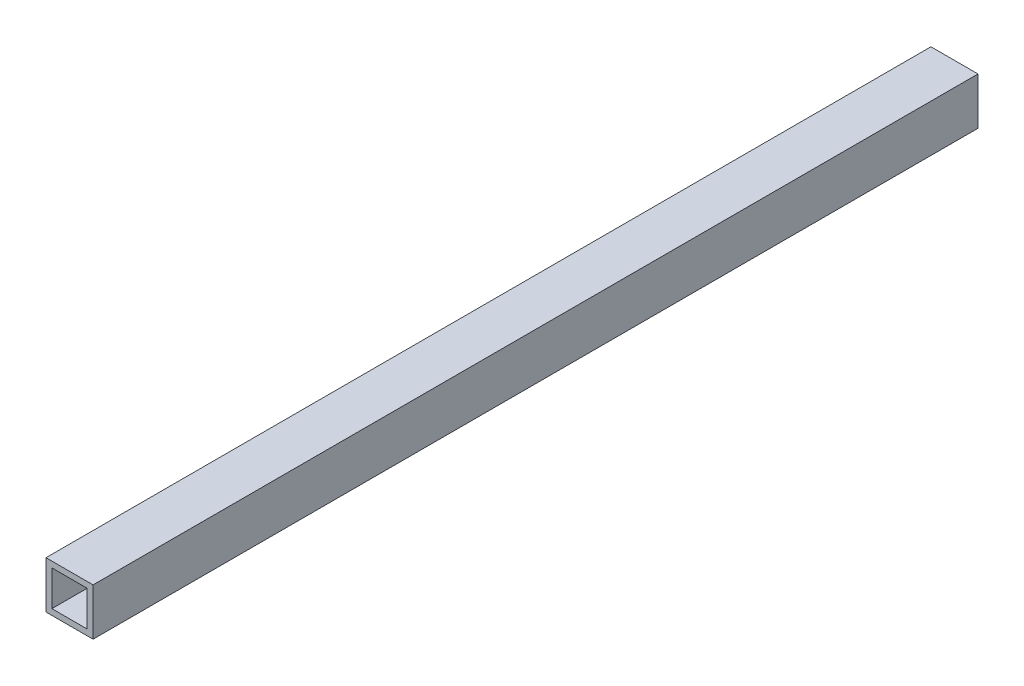
ISO-10303-21;
HEADER;
FILE_DESCRIPTION(('STEP AP214'),'2;1');
FILE_NAME('part.step','',(''),(''),'','','');
FILE_SCHEMA(('AUTOMOTIVE_DESIGN { 1 0 10303 214 1 1 1 1 }'));
ENDSEC;
DATA;
#1=APPLICATION_CONTEXT('core data for automotive mechanical design processes');
#2=APPLICATION_PROTOCOL_DEFINITION('international standard','automotive_design',2000,#1);
#3=PRODUCT_CONTEXT('',#1,'mechanical');
#4=PRODUCT('Part','Part','',(#3));
#5=PRODUCT_RELATED_PRODUCT_CATEGORY('part','',(#4));
#6=PRODUCT_DEFINITION_FORMATION('','',#4);
#7=PRODUCT_DEFINITION_CONTEXT('part definition',#1,'design');
#8=PRODUCT_DEFINITION('design','',#6,#7);
#9=PRODUCT_DEFINITION_SHAPE('','',#8);
#10=(LENGTH_UNIT() NAMED_UNIT(*) SI_UNIT(.MILLI.,.METRE.));
#11=(NAMED_UNIT(*) PLANE_ANGLE_UNIT() SI_UNIT($,.RADIAN.));
#12=(NAMED_UNIT(*) SI_UNIT($,.STERADIAN.) SOLID_ANGLE_UNIT());
#13=UNCERTAINTY_MEASURE_WITH_UNIT(LENGTH_MEASURE(1.E-05),#10,'distance_accuracy_value','');
#14=(GEOMETRIC_REPRESENTATION_CONTEXT(3) GLOBAL_UNCERTAINTY_ASSIGNED_CONTEXT((#13)) GLOBAL_UNIT_ASSIGNED_CONTEXT((#10,
#11,#12)) REPRESENTATION_CONTEXT('',''));
#15=CARTESIAN_POINT('',(0.,0.,0.));
#16=DIRECTION('',(0.,0.,1.));
#17=DIRECTION('',(1.,0.,0.));
#18=AXIS2_PLACEMENT_3D('',#15,#16,#17);
#19=CARTESIAN_POINT('',(0.,0.,238.76));
#20=DIRECTION('',(0.,0.,1.));
#21=DIRECTION('',(1.,0.,0.));
#22=AXIS2_PLACEMENT_3D('',#19,#20,#21);
#23=PLANE('',#22);
#24=DIRECTION('',(0.,-1.,0.));
#25=VECTOR('',#24,1.);
#26=CARTESIAN_POINT('',(-12.7,-12.7,238.76));
#27=LINE('',#26,#25);
#28=CARTESIAN_POINT('',(-12.7,12.7,238.76));
#29=VERTEX_POINT('',#28);
#30=CARTESIAN_POINT('',(-12.7,-12.7,238.76));
#31=VERTEX_POINT('',#30);
#32=EDGE_CURVE('E117',#29,#31,#27,.T.);
#33=ORIENTED_EDGE('',*,*,#32,.T.);
#34=DIRECTION('',(1.,0.,0.));
#35=VECTOR('',#34,1.);
#36=CARTESIAN_POINT('',(12.7,-12.7,238.76));
#37=LINE('',#36,#35);
#38=CARTESIAN_POINT('',(12.7,-12.7,238.76));
#39=VERTEX_POINT('',#38);
#40=EDGE_CURVE('E176',#31,#39,#37,.T.);
#41=ORIENTED_EDGE('',*,*,#40,.T.);
#42=DIRECTION('',(0.,1.,0.));
#43=VECTOR('',#42,1.);
#44=CARTESIAN_POINT('',(12.7,-12.7,238.76));
#45=LINE('',#44,#43);
#46=CARTESIAN_POINT('',(12.7,12.7,238.76));
#47=VERTEX_POINT('',#46);
#48=EDGE_CURVE('E179',#39,#47,#45,.T.);
#49=ORIENTED_EDGE('',*,*,#48,.T.);
#50=DIRECTION('',(-1.,0.,0.));
#51=VECTOR('',#50,1.);
#52=CARTESIAN_POINT('',(12.7,12.7,238.76));
#53=LINE('',#52,#51);
#54=EDGE_CURVE('E63',#47,#29,#53,.T.);
#55=ORIENTED_EDGE('',*,*,#54,.T.);
#56=EDGE_LOOP('',(#33,#41,#49,#55));
#57=FACE_BOUND('',#56,.T.);
#58=DIRECTION('',(1.,0.,0.));
#59=VECTOR('',#58,1.);
#60=CARTESIAN_POINT('',(9.525,-9.525,238.76));
#61=LINE('',#60,#59);
#62=CARTESIAN_POINT('',(-9.52499999999999,-9.525,238.76));
#63=VERTEX_POINT('',#62);
#64=CARTESIAN_POINT('',(9.525,-9.525,238.76));
#65=VERTEX_POINT('',#64);
#66=EDGE_CURVE('E158',#63,#65,#61,.T.);
#67=ORIENTED_EDGE('',*,*,#66,.F.);
#68=DIRECTION('',(0.,-1.,0.));
#69=VECTOR('',#68,1.);
#70=CARTESIAN_POINT('',(-9.52499999999999,-9.525,238.76));
#71=LINE('',#70,#69);
#72=CARTESIAN_POINT('',(-9.52499999999999,9.525,238.76));
#73=VERTEX_POINT('',#72);
#74=EDGE_CURVE('E113',#73,#63,#71,.T.);
#75=ORIENTED_EDGE('',*,*,#74,.F.);
#76=DIRECTION('',(-1.,0.,0.));
#77=VECTOR('',#76,1.);
#78=CARTESIAN_POINT('',(9.525,9.525,238.76));
#79=LINE('',#78,#77);
#80=CARTESIAN_POINT('',(9.525,9.525,238.76));
#81=VERTEX_POINT('',#80);
#82=EDGE_CURVE('E164',#81,#73,#79,.T.);
#83=ORIENTED_EDGE('',*,*,#82,.F.);
#84=DIRECTION('',(0.,1.,0.));
#85=VECTOR('',#84,1.);
#86=CARTESIAN_POINT('',(9.525,-9.525,238.76));
#87=LINE('',#86,#85);
#88=EDGE_CURVE('E161',#65,#81,#87,.T.);
#89=ORIENTED_EDGE('',*,*,#88,.F.);
#90=EDGE_LOOP('',(#67,#75,#83,#89));
#91=FACE_BOUND('',#90,.T.);
#92=ADVANCED_FACE('F39',(#57,#91),#23,.T.);
#93=CARTESIAN_POINT('',(-12.7,-12.7,238.76));
#94=DIRECTION('',(1.,0.,0.));
#95=DIRECTION('',(0.,0.,-1.));
#96=AXIS2_PLACEMENT_3D('',#93,#94,#95);
#97=PLANE('',#96);
#98=DIRECTION('',(0.,0.,-1.));
#99=VECTOR('',#98,1.);
#100=CARTESIAN_POINT('',(-12.7,12.7,238.76));
#101=LINE('',#100,#99);
#102=CARTESIAN_POINT('',(-12.7,12.7,-238.76));
#103=VERTEX_POINT('',#102);
#104=EDGE_CURVE('E184',#29,#103,#101,.T.);
#105=ORIENTED_EDGE('',*,*,#104,.T.);
#106=DIRECTION('',(0.,-1.,0.));
#107=VECTOR('',#106,1.);
#108=CARTESIAN_POINT('',(-12.7,-12.7,-238.76));
#109=LINE('',#108,#107);
#110=CARTESIAN_POINT('',(-12.7,-12.7,-238.76));
#111=VERTEX_POINT('',#110);
#112=EDGE_CURVE('E140',#103,#111,#109,.T.);
#113=ORIENTED_EDGE('',*,*,#112,.T.);
#114=DIRECTION('',(0.,0.,-1.));
#115=VECTOR('',#114,1.);
#116=CARTESIAN_POINT('',(-12.7,-12.7,238.76));
#117=LINE('',#116,#115);
#118=EDGE_CURVE('E11',#31,#111,#117,.T.);
#119=ORIENTED_EDGE('',*,*,#118,.F.);
#120=ORIENTED_EDGE('',*,*,#32,.F.);
#121=EDGE_LOOP('',(#105,#113,#119,#120));
#122=FACE_BOUND('',#121,.T.);
#123=ADVANCED_FACE('F41',(#122),#97,.F.);
#124=CARTESIAN_POINT('',(12.7,-12.7,238.76));
#125=DIRECTION('',(0.,1.,0.));
#126=DIRECTION('',(0.,0.,1.));
#127=AXIS2_PLACEMENT_3D('',#124,#125,#126);
#128=PLANE('',#127);
#129=ORIENTED_EDGE('',*,*,#118,.T.);
#130=DIRECTION('',(1.,0.,0.));
#131=VECTOR('',#130,1.);
#132=CARTESIAN_POINT('',(12.7,-12.7,-238.76));
#133=LINE('',#132,#131);
#134=CARTESIAN_POINT('',(12.7,-12.7,-238.76));
#135=VERTEX_POINT('',#134);
#136=EDGE_CURVE('E144',#111,#135,#133,.T.);
#137=ORIENTED_EDGE('',*,*,#136,.T.);
#138=DIRECTION('',(0.,0.,-1.));
#139=VECTOR('',#138,1.);
#140=CARTESIAN_POINT('',(12.7,-12.7,238.76));
#141=LINE('',#140,#139);
#142=EDGE_CURVE('E48',#39,#135,#141,.T.);
#143=ORIENTED_EDGE('',*,*,#142,.F.);
#144=ORIENTED_EDGE('',*,*,#40,.F.);
#145=EDGE_LOOP('',(#129,#137,#143,#144));
#146=FACE_BOUND('',#145,.T.);
#147=ADVANCED_FACE('F200',(#146),#128,.F.);
#148=CARTESIAN_POINT('',(12.7,-12.7,238.76));
#149=DIRECTION('',(-1.,0.,0.));
#150=DIRECTION('',(0.,0.,1.));
#151=AXIS2_PLACEMENT_3D('',#148,#149,#150);
#152=PLANE('',#151);
#153=ORIENTED_EDGE('',*,*,#142,.T.);
#154=DIRECTION('',(0.,1.,0.));
#155=VECTOR('',#154,1.);
#156=CARTESIAN_POINT('',(12.7,-12.7,-238.76));
#157=LINE('',#156,#155);
#158=CARTESIAN_POINT('',(12.7,12.7,-238.76));
#159=VERTEX_POINT('',#158);
#160=EDGE_CURVE('E148',#135,#159,#157,.T.);
#161=ORIENTED_EDGE('',*,*,#160,.T.);
#162=DIRECTION('',(0.,0.,-1.));
#163=VECTOR('',#162,1.);
#164=CARTESIAN_POINT('',(12.7,12.7,238.76));
#165=LINE('',#164,#163);
#166=EDGE_CURVE('E187',#47,#159,#165,.T.);
#167=ORIENTED_EDGE('',*,*,#166,.F.);
#168=ORIENTED_EDGE('',*,*,#48,.F.);
#169=EDGE_LOOP('',(#153,#161,#167,#168));
#170=FACE_BOUND('',#169,.T.);
#171=ADVANCED_FACE('F194',(#170),#152,.F.);
#172=CARTESIAN_POINT('',(12.7,12.7,238.76));
#173=DIRECTION('',(0.,-1.,0.));
#174=DIRECTION('',(0.,0.,-1.));
#175=AXIS2_PLACEMENT_3D('',#172,#173,#174);
#176=PLANE('',#175);
#177=ORIENTED_EDGE('',*,*,#166,.T.);
#178=DIRECTION('',(-1.,0.,0.));
#179=VECTOR('',#178,1.);
#180=CARTESIAN_POINT('',(12.7,12.7,-238.76));
#181=LINE('',#180,#179);
#182=EDGE_CURVE('E152',#159,#103,#181,.T.);
#183=ORIENTED_EDGE('',*,*,#182,.T.);
#184=ORIENTED_EDGE('',*,*,#104,.F.);
#185=ORIENTED_EDGE('',*,*,#54,.F.);
#186=EDGE_LOOP('',(#177,#183,#184,#185));
#187=FACE_BOUND('',#186,.T.);
#188=ADVANCED_FACE('F205',(#187),#176,.F.);
#189=CARTESIAN_POINT('',(-9.52499999999999,-9.525,238.76));
#190=DIRECTION('',(1.,0.,0.));
#191=DIRECTION('',(0.,0.,-1.));
#192=AXIS2_PLACEMENT_3D('',#189,#190,#191);
#193=PLANE('',#192);
#194=DIRECTION('',(0.,0.,-1.));
#195=VECTOR('',#194,1.);
#196=CARTESIAN_POINT('',(-9.52499999999999,-9.525,238.76));
#197=LINE('',#196,#195);
#198=CARTESIAN_POINT('',(-9.52499999999999,-9.525,-238.76));
#199=VERTEX_POINT('',#198);
#200=EDGE_CURVE('E105',#63,#199,#197,.T.);
#201=ORIENTED_EDGE('',*,*,#200,.T.);
#202=DIRECTION('',(0.,-1.,0.));
#203=VECTOR('',#202,1.);
#204=CARTESIAN_POINT('',(-9.52499999999999,-9.525,-238.76));
#205=LINE('',#204,#203);
#206=CARTESIAN_POINT('',(-9.52499999999999,9.525,-238.76));
#207=VERTEX_POINT('',#206);
#208=EDGE_CURVE('E110',#207,#199,#205,.T.);
#209=ORIENTED_EDGE('',*,*,#208,.F.);
#210=DIRECTION('',(0.,0.,-1.));
#211=VECTOR('',#210,1.);
#212=CARTESIAN_POINT('',(-9.52499999999999,9.525,238.76));
#213=LINE('',#212,#211);
#214=EDGE_CURVE('E167',#73,#207,#213,.T.);
#215=ORIENTED_EDGE('',*,*,#214,.F.);
#216=ORIENTED_EDGE('',*,*,#74,.T.);
#217=EDGE_LOOP('',(#201,#209,#215,#216));
#218=FACE_BOUND('',#217,.T.);
#219=ADVANCED_FACE('F107',(#218),#193,.T.);
#220=CARTESIAN_POINT('',(9.525,-9.525,238.76));
#221=DIRECTION('',(0.,1.,0.));
#222=DIRECTION('',(0.,0.,1.));
#223=AXIS2_PLACEMENT_3D('',#220,#221,#222);
#224=PLANE('',#223);
#225=DIRECTION('',(0.,0.,-1.));
#226=VECTOR('',#225,1.);
#227=CARTESIAN_POINT('',(9.525,-9.525,238.76));
#228=LINE('',#227,#226);
#229=CARTESIAN_POINT('',(9.525,-9.525,-238.76));
#230=VERTEX_POINT('',#229);
#231=EDGE_CURVE('E118',#65,#230,#228,.T.);
#232=ORIENTED_EDGE('',*,*,#231,.T.);
#233=DIRECTION('',(1.,0.,0.));
#234=VECTOR('',#233,1.);
#235=CARTESIAN_POINT('',(9.525,-9.525,-238.76));
#236=LINE('',#235,#234);
#237=EDGE_CURVE('E121',#199,#230,#236,.T.);
#238=ORIENTED_EDGE('',*,*,#237,.F.);
#239=ORIENTED_EDGE('',*,*,#200,.F.);
#240=ORIENTED_EDGE('',*,*,#66,.T.);
#241=EDGE_LOOP('',(#232,#238,#239,#240));
#242=FACE_BOUND('',#241,.T.);
#243=ADVANCED_FACE('F122',(#242),#224,.T.);
#244=CARTESIAN_POINT('',(9.525,-9.525,238.76));
#245=DIRECTION('',(-1.,0.,0.));
#246=DIRECTION('',(0.,0.,1.));
#247=AXIS2_PLACEMENT_3D('',#244,#245,#246);
#248=PLANE('',#247);
#249=DIRECTION('',(0.,0.,-1.));
#250=VECTOR('',#249,1.);
#251=CARTESIAN_POINT('',(9.525,9.525,238.76));
#252=LINE('',#251,#250);
#253=CARTESIAN_POINT('',(9.525,9.525,-238.76));
#254=VERTEX_POINT('',#253);
#255=EDGE_CURVE('E55',#81,#254,#252,.T.);
#256=ORIENTED_EDGE('',*,*,#255,.T.);
#257=DIRECTION('',(0.,1.,0.));
#258=VECTOR('',#257,1.);
#259=CARTESIAN_POINT('',(9.525,-9.525,-238.76));
#260=LINE('',#259,#258);
#261=EDGE_CURVE('E128',#230,#254,#260,.T.);
#262=ORIENTED_EDGE('',*,*,#261,.F.);
#263=ORIENTED_EDGE('',*,*,#231,.F.);
#264=ORIENTED_EDGE('',*,*,#88,.T.);
#265=EDGE_LOOP('',(#256,#262,#263,#264));
#266=FACE_BOUND('',#265,.T.);
#267=ADVANCED_FACE('F223',(#266),#248,.T.);
#268=CARTESIAN_POINT('',(9.525,9.525,238.76));
#269=DIRECTION('',(0.,-1.,0.));
#270=DIRECTION('',(0.,0.,-1.));
#271=AXIS2_PLACEMENT_3D('',#268,#269,#270);
#272=PLANE('',#271);
#273=ORIENTED_EDGE('',*,*,#214,.T.);
#274=DIRECTION('',(-1.,0.,0.));
#275=VECTOR('',#274,1.);
#276=CARTESIAN_POINT('',(9.525,9.525,-238.76));
#277=LINE('',#276,#275);
#278=EDGE_CURVE('E132',#254,#207,#277,.T.);
#279=ORIENTED_EDGE('',*,*,#278,.F.);
#280=ORIENTED_EDGE('',*,*,#255,.F.);
#281=ORIENTED_EDGE('',*,*,#82,.T.);
#282=EDGE_LOOP('',(#273,#279,#280,#281));
#283=FACE_BOUND('',#282,.T.);
#284=ADVANCED_FACE('F226',(#283),#272,.T.);
#285=CARTESIAN_POINT('',(0.,0.,-238.76));
#286=DIRECTION('',(0.,0.,1.));
#287=DIRECTION('',(1.,0.,0.));
#288=AXIS2_PLACEMENT_3D('',#285,#286,#287);
#289=PLANE('',#288);
#290=ORIENTED_EDGE('',*,*,#278,.T.);
#291=ORIENTED_EDGE('',*,*,#208,.T.);
#292=ORIENTED_EDGE('',*,*,#237,.T.);
#293=ORIENTED_EDGE('',*,*,#261,.T.);
#294=EDGE_LOOP('',(#290,#291,#292,#293));
#295=FACE_BOUND('',#294,.T.);
#296=ORIENTED_EDGE('',*,*,#112,.F.);
#297=ORIENTED_EDGE('',*,*,#182,.F.);
#298=ORIENTED_EDGE('',*,*,#160,.F.);
#299=ORIENTED_EDGE('',*,*,#136,.F.);
#300=EDGE_LOOP('',(#296,#297,#298,#299));
#301=FACE_BOUND('',#300,.T.);
#302=ADVANCED_FACE('F130',(#295,#301),#289,.F.);
#303=CLOSED_SHELL('',(#92,#123,#147,#171,#188,#219,#243,#267,#284,#302));
#304=MANIFOLD_SOLID_BREP('B2',#303);
#305=ADVANCED_BREP_SHAPE_REPRESENTATION('',(#18,#304),#14);
#306=SHAPE_DEFINITION_REPRESENTATION(#9,#305);
ENDSEC;
END-ISO-10303-21;
